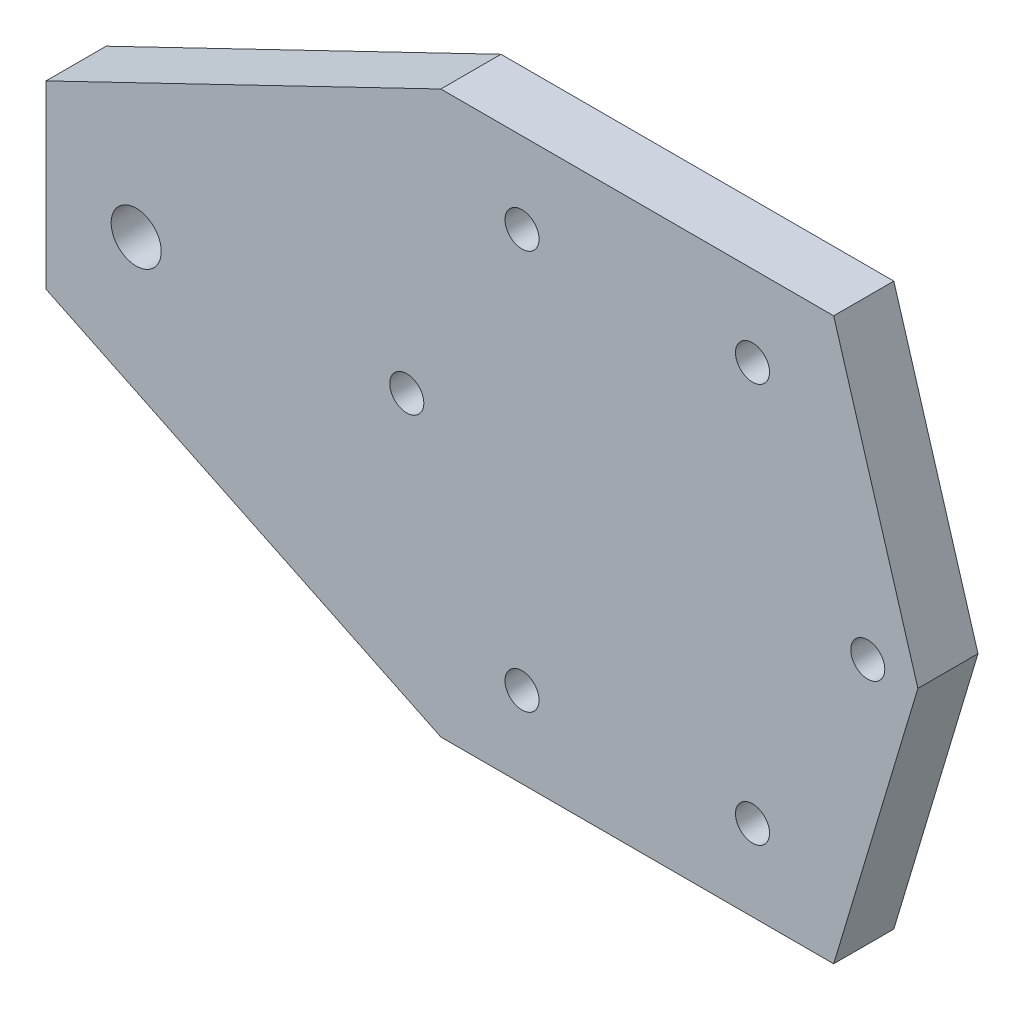
ISO-10303-21;
HEADER;
FILE_DESCRIPTION(('STEP AP214'),'2;1');
FILE_NAME('part.step','',(''),(''),'','','');
FILE_SCHEMA(('AUTOMOTIVE_DESIGN { 1 0 10303 214 1 1 1 1 }'));
ENDSEC;
DATA;
#1=APPLICATION_CONTEXT('core data for automotive mechanical design processes');
#2=APPLICATION_PROTOCOL_DEFINITION('international standard','automotive_design',2000,#1);
#3=PRODUCT_CONTEXT('',#1,'mechanical');
#4=PRODUCT('Part','Part','',(#3));
#5=PRODUCT_RELATED_PRODUCT_CATEGORY('part','',(#4));
#6=PRODUCT_DEFINITION_FORMATION('','',#4);
#7=PRODUCT_DEFINITION_CONTEXT('part definition',#1,'design');
#8=PRODUCT_DEFINITION('design','',#6,#7);
#9=PRODUCT_DEFINITION_SHAPE('','',#8);
#10=(LENGTH_UNIT() NAMED_UNIT(*) SI_UNIT(.MILLI.,.METRE.));
#11=(NAMED_UNIT(*) PLANE_ANGLE_UNIT() SI_UNIT($,.RADIAN.));
#12=(NAMED_UNIT(*) SI_UNIT($,.STERADIAN.) SOLID_ANGLE_UNIT());
#13=UNCERTAINTY_MEASURE_WITH_UNIT(LENGTH_MEASURE(1.E-05),#10,'distance_accuracy_value','');
#14=(GEOMETRIC_REPRESENTATION_CONTEXT(3) GLOBAL_UNCERTAINTY_ASSIGNED_CONTEXT((#13)) GLOBAL_UNIT_ASSIGNED_CONTEXT((#10,
#11,#12)) REPRESENTATION_CONTEXT('',''));
#15=CARTESIAN_POINT('',(0.,0.,0.));
#16=DIRECTION('',(0.,0.,1.));
#17=DIRECTION('',(1.,0.,0.));
#18=AXIS2_PLACEMENT_3D('',#15,#16,#17);
#19=CARTESIAN_POINT('',(0.,0.,6.));
#20=DIRECTION('',(0.,0.,1.));
#21=DIRECTION('',(1.,0.,0.));
#22=AXIS2_PLACEMENT_3D('',#19,#20,#21);
#23=PLANE('',#22);
#24=CARTESIAN_POINT('',(11.5,-19.9185842870421,6.));
#25=DIRECTION('',(0.,0.,1.));
#26=DIRECTION('',(1.,0.,0.));
#27=AXIS2_PLACEMENT_3D('',#24,#25,#26);
#28=CIRCLE('',#27,1.7);
#29=CARTESIAN_POINT('',(13.2,-19.9185842870421,6.));
#30=VERTEX_POINT('',#29);
#31=EDGE_CURVE('E193',#30,#30,#28,.T.);
#32=ORIENTED_EDGE('',*,*,#31,.F.);
#33=EDGE_LOOP('',(#32));
#34=FACE_BOUND('',#33,.T.);
#35=CARTESIAN_POINT('',(-23.,0.,6.));
#36=DIRECTION('',(0.,0.,1.));
#37=DIRECTION('',(1.,0.,0.));
#38=AXIS2_PLACEMENT_3D('',#35,#36,#37);
#39=CIRCLE('',#38,1.7);
#40=CARTESIAN_POINT('',(-21.3,0.,6.));
#41=VERTEX_POINT('',#40);
#42=EDGE_CURVE('E185',#41,#41,#39,.T.);
#43=ORIENTED_EDGE('',*,*,#42,.F.);
#44=EDGE_LOOP('',(#43));
#45=FACE_BOUND('',#44,.T.);
#46=CARTESIAN_POINT('',(11.5,19.9185842870421,6.));
#47=DIRECTION('',(0.,0.,1.));
#48=DIRECTION('',(1.,0.,0.));
#49=AXIS2_PLACEMENT_3D('',#46,#47,#48);
#50=CIRCLE('',#49,1.7);
#51=CARTESIAN_POINT('',(13.2,19.9185842870421,6.));
#52=VERTEX_POINT('',#51);
#53=EDGE_CURVE('E168',#52,#52,#50,.T.);
#54=ORIENTED_EDGE('',*,*,#53,.F.);
#55=EDGE_LOOP('',(#54));
#56=FACE_BOUND('',#55,.T.);
#57=DIRECTION('',(0.,-1.,0.));
#58=VECTOR('',#57,1.);
#59=CARTESIAN_POINT('',(-59.,9.,6.));
#60=LINE('',#59,#58);
#61=CARTESIAN_POINT('',(-59.,9.,6.));
#62=VERTEX_POINT('',#61);
#63=CARTESIAN_POINT('',(-59.,-9.,6.));
#64=VERTEX_POINT('',#63);
#65=EDGE_CURVE('E141',#62,#64,#60,.T.);
#66=ORIENTED_EDGE('',*,*,#65,.T.);
#67=DIRECTION('',(0.900736738123452,-0.43436543208999,0.));
#68=VECTOR('',#67,1.);
#69=CARTESIAN_POINT('',(-59.,-9.,6.));
#70=LINE('',#69,#68);
#71=CARTESIAN_POINT('',(-19.6,-28.,6.));
#72=VERTEX_POINT('',#71);
#73=EDGE_CURVE('E96',#64,#72,#70,.T.);
#74=ORIENTED_EDGE('',*,*,#73,.T.);
#75=DIRECTION('',(1.,0.,0.));
#76=VECTOR('',#75,1.);
#77=CARTESIAN_POINT('',(-19.6,-28.,6.));
#78=LINE('',#77,#76);
#79=CARTESIAN_POINT('',(19.6,-28.,6.));
#80=VERTEX_POINT('',#79);
#81=EDGE_CURVE('E154',#72,#80,#78,.T.);
#82=ORIENTED_EDGE('',*,*,#81,.T.);
#83=DIRECTION('',(0.287347885566345,0.957826285221151,0.));
#84=VECTOR('',#83,1.);
#85=CARTESIAN_POINT('',(19.6,-28.,6.));
#86=LINE('',#85,#84);
#87=CARTESIAN_POINT('',(28.,0.,6.));
#88=VERTEX_POINT('',#87);
#89=EDGE_CURVE('E115',#80,#88,#86,.T.);
#90=ORIENTED_EDGE('',*,*,#89,.T.);
#91=DIRECTION('',(-0.287347885566345,0.957826285221151,0.));
#92=VECTOR('',#91,1.);
#93=CARTESIAN_POINT('',(28.,0.,6.));
#94=LINE('',#93,#92);
#95=CARTESIAN_POINT('',(19.6,28.,6.));
#96=VERTEX_POINT('',#95);
#97=EDGE_CURVE('E106',#88,#96,#94,.T.);
#98=ORIENTED_EDGE('',*,*,#97,.T.);
#99=DIRECTION('',(-1.,0.,0.));
#100=VECTOR('',#99,1.);
#101=CARTESIAN_POINT('',(19.6,28.,6.));
#102=LINE('',#101,#100);
#103=CARTESIAN_POINT('',(-19.6,28.,6.));
#104=VERTEX_POINT('',#103);
#105=EDGE_CURVE('E109',#96,#104,#102,.T.);
#106=ORIENTED_EDGE('',*,*,#105,.T.);
#107=DIRECTION('',(-0.900736738123452,-0.43436543208999,0.));
#108=VECTOR('',#107,1.);
#109=CARTESIAN_POINT('',(-19.6,28.,6.));
#110=LINE('',#109,#108);
#111=EDGE_CURVE('E57',#104,#62,#110,.T.);
#112=ORIENTED_EDGE('',*,*,#111,.T.);
#113=EDGE_LOOP('',(#66,#74,#82,#90,#98,#106,#112));
#114=FACE_BOUND('',#113,.T.);
#115=CARTESIAN_POINT('',(23.,0.,6.));
#116=DIRECTION('',(0.,0.,1.));
#117=DIRECTION('',(1.,0.,0.));
#118=AXIS2_PLACEMENT_3D('',#115,#116,#117);
#119=CIRCLE('',#118,1.7);
#120=CARTESIAN_POINT('',(24.7,0.,6.));
#121=VERTEX_POINT('',#120);
#122=EDGE_CURVE('E131',#121,#121,#119,.T.);
#123=ORIENTED_EDGE('',*,*,#122,.F.);
#124=EDGE_LOOP('',(#123));
#125=FACE_BOUND('',#124,.T.);
#126=CARTESIAN_POINT('',(-11.5,19.9185842870421,6.));
#127=DIRECTION('',(0.,0.,1.));
#128=DIRECTION('',(1.,0.,0.));
#129=AXIS2_PLACEMENT_3D('',#126,#127,#128);
#130=CIRCLE('',#129,1.7);
#131=CARTESIAN_POINT('',(-9.79999999999999,19.9185842870421,6.));
#132=VERTEX_POINT('',#131);
#133=EDGE_CURVE('E176',#132,#132,#130,.T.);
#134=ORIENTED_EDGE('',*,*,#133,.F.);
#135=EDGE_LOOP('',(#134));
#136=FACE_BOUND('',#135,.T.);
#137=CARTESIAN_POINT('',(-11.5,-19.9185842870421,6.));
#138=DIRECTION('',(0.,0.,1.));
#139=DIRECTION('',(1.,0.,0.));
#140=AXIS2_PLACEMENT_3D('',#137,#138,#139);
#141=CIRCLE('',#140,1.7);
#142=CARTESIAN_POINT('',(-9.80000000000001,-19.9185842870421,6.));
#143=VERTEX_POINT('',#142);
#144=EDGE_CURVE('E189',#143,#143,#141,.T.);
#145=ORIENTED_EDGE('',*,*,#144,.F.);
#146=EDGE_LOOP('',(#145));
#147=FACE_BOUND('',#146,.T.);
#148=CARTESIAN_POINT('',(-50.,0.,6.));
#149=DIRECTION('',(0.,0.,1.));
#150=DIRECTION('',(1.,0.,0.));
#151=AXIS2_PLACEMENT_3D('',#148,#149,#150);
#152=CIRCLE('',#151,2.5);
#153=CARTESIAN_POINT('',(-47.5,0.,6.));
#154=VERTEX_POINT('',#153);
#155=EDGE_CURVE('E199',#154,#154,#152,.T.);
#156=ORIENTED_EDGE('',*,*,#155,.F.);
#157=EDGE_LOOP('',(#156));
#158=FACE_BOUND('',#157,.T.);
#159=ADVANCED_FACE('F39',(#34,#45,#56,#114,#125,#136,#147,#158),#23,.T.);
#160=CARTESIAN_POINT('',(0.,0.,0.));
#161=DIRECTION('',(0.,0.,1.));
#162=DIRECTION('',(1.,0.,0.));
#163=AXIS2_PLACEMENT_3D('',#160,#161,#162);
#164=PLANE('',#163);
#165=CARTESIAN_POINT('',(0.,0.,0.));
#166=DIRECTION('',(0.,0.,1.));
#167=DIRECTION('',(1.,0.,0.));
#168=AXIS2_PLACEMENT_3D('',#165,#166,#167);
#169=CIRCLE('',#168,17.15);
#170=CARTESIAN_POINT('',(17.15,0.,0.));
#171=VERTEX_POINT('',#170);
#172=EDGE_CURVE('E207',#171,#171,#169,.T.);
#173=ORIENTED_EDGE('',*,*,#172,.T.);
#174=EDGE_LOOP('',(#173));
#175=FACE_BOUND('',#174,.T.);
#176=DIRECTION('',(0.,-1.,0.));
#177=VECTOR('',#176,1.);
#178=CARTESIAN_POINT('',(-59.,9.,0.));
#179=LINE('',#178,#177);
#180=CARTESIAN_POINT('',(-59.,9.,0.));
#181=VERTEX_POINT('',#180);
#182=CARTESIAN_POINT('',(-59.,-9.,0.));
#183=VERTEX_POINT('',#182);
#184=EDGE_CURVE('E128',#181,#183,#179,.T.);
#185=ORIENTED_EDGE('',*,*,#184,.F.);
#186=DIRECTION('',(-0.900736738123452,-0.43436543208999,0.));
#187=VECTOR('',#186,1.);
#188=CARTESIAN_POINT('',(-19.6,28.,0.));
#189=LINE('',#188,#187);
#190=CARTESIAN_POINT('',(-19.6,28.,0.));
#191=VERTEX_POINT('',#190);
#192=EDGE_CURVE('E86',#191,#181,#189,.T.);
#193=ORIENTED_EDGE('',*,*,#192,.F.);
#194=DIRECTION('',(-1.,0.,0.));
#195=VECTOR('',#194,1.);
#196=CARTESIAN_POINT('',(19.6,28.,0.));
#197=LINE('',#196,#195);
#198=CARTESIAN_POINT('',(19.6,28.,0.));
#199=VERTEX_POINT('',#198);
#200=EDGE_CURVE('E82',#199,#191,#197,.T.);
#201=ORIENTED_EDGE('',*,*,#200,.F.);
#202=DIRECTION('',(-0.287347885566345,0.957826285221151,0.));
#203=VECTOR('',#202,1.);
#204=CARTESIAN_POINT('',(28.,0.,0.));
#205=LINE('',#204,#203);
#206=CARTESIAN_POINT('',(28.,0.,0.));
#207=VERTEX_POINT('',#206);
#208=EDGE_CURVE('E118',#207,#199,#205,.T.);
#209=ORIENTED_EDGE('',*,*,#208,.F.);
#210=DIRECTION('',(0.287347885566345,0.957826285221151,0.));
#211=VECTOR('',#210,1.);
#212=CARTESIAN_POINT('',(19.6,-28.,0.));
#213=LINE('',#212,#211);
#214=CARTESIAN_POINT('',(19.6,-28.,0.));
#215=VERTEX_POINT('',#214);
#216=EDGE_CURVE('E139',#215,#207,#213,.T.);
#217=ORIENTED_EDGE('',*,*,#216,.F.);
#218=DIRECTION('',(1.,0.,0.));
#219=VECTOR('',#218,1.);
#220=CARTESIAN_POINT('',(-19.6,-28.,0.));
#221=LINE('',#220,#219);
#222=CARTESIAN_POINT('',(-19.6,-28.,0.));
#223=VERTEX_POINT('',#222);
#224=EDGE_CURVE('E136',#223,#215,#221,.T.);
#225=ORIENTED_EDGE('',*,*,#224,.F.);
#226=DIRECTION('',(0.900736738123452,-0.43436543208999,0.));
#227=VECTOR('',#226,1.);
#228=CARTESIAN_POINT('',(-59.,-9.,0.));
#229=LINE('',#228,#227);
#230=EDGE_CURVE('E134',#183,#223,#229,.T.);
#231=ORIENTED_EDGE('',*,*,#230,.F.);
#232=EDGE_LOOP('',(#185,#193,#201,#209,#217,#225,#231));
#233=FACE_BOUND('',#232,.T.);
#234=CARTESIAN_POINT('',(23.,0.,0.));
#235=DIRECTION('',(0.,0.,1.));
#236=DIRECTION('',(1.,0.,0.));
#237=AXIS2_PLACEMENT_3D('',#234,#235,#236);
#238=CIRCLE('',#237,1.7);
#239=CARTESIAN_POINT('',(24.7,0.,0.));
#240=VERTEX_POINT('',#239);
#241=EDGE_CURVE('E170',#240,#240,#238,.T.);
#242=ORIENTED_EDGE('',*,*,#241,.T.);
#243=EDGE_LOOP('',(#242));
#244=FACE_BOUND('',#243,.T.);
#245=CARTESIAN_POINT('',(11.5,19.9185842870421,0.));
#246=DIRECTION('',(0.,0.,1.));
#247=DIRECTION('',(1.,0.,0.));
#248=AXIS2_PLACEMENT_3D('',#245,#246,#247);
#249=CIRCLE('',#248,1.7);
#250=CARTESIAN_POINT('',(13.2,19.9185842870421,0.));
#251=VERTEX_POINT('',#250);
#252=EDGE_CURVE('E174',#251,#251,#249,.T.);
#253=ORIENTED_EDGE('',*,*,#252,.T.);
#254=EDGE_LOOP('',(#253));
#255=FACE_BOUND('',#254,.T.);
#256=CARTESIAN_POINT('',(-11.5,19.9185842870421,0.));
#257=DIRECTION('',(0.,0.,1.));
#258=DIRECTION('',(1.,0.,0.));
#259=AXIS2_PLACEMENT_3D('',#256,#257,#258);
#260=CIRCLE('',#259,1.7);
#261=CARTESIAN_POINT('',(-9.79999999999999,19.9185842870421,0.));
#262=VERTEX_POINT('',#261);
#263=EDGE_CURVE('E178',#262,#262,#260,.T.);
#264=ORIENTED_EDGE('',*,*,#263,.T.);
#265=EDGE_LOOP('',(#264));
#266=FACE_BOUND('',#265,.T.);
#267=CARTESIAN_POINT('',(-23.,0.,0.));
#268=DIRECTION('',(0.,0.,1.));
#269=DIRECTION('',(1.,0.,0.));
#270=AXIS2_PLACEMENT_3D('',#267,#268,#269);
#271=CIRCLE('',#270,1.7);
#272=CARTESIAN_POINT('',(-21.3,0.,0.));
#273=VERTEX_POINT('',#272);
#274=EDGE_CURVE('E183',#273,#273,#271,.T.);
#275=ORIENTED_EDGE('',*,*,#274,.T.);
#276=EDGE_LOOP('',(#275));
#277=FACE_BOUND('',#276,.T.);
#278=CARTESIAN_POINT('',(-11.5,-19.9185842870421,0.));
#279=DIRECTION('',(0.,0.,1.));
#280=DIRECTION('',(1.,0.,0.));
#281=AXIS2_PLACEMENT_3D('',#278,#279,#280);
#282=CIRCLE('',#281,1.7);
#283=CARTESIAN_POINT('',(-9.80000000000001,-19.9185842870421,0.));
#284=VERTEX_POINT('',#283);
#285=EDGE_CURVE('E191',#284,#284,#282,.T.);
#286=ORIENTED_EDGE('',*,*,#285,.T.);
#287=EDGE_LOOP('',(#286));
#288=FACE_BOUND('',#287,.T.);
#289=CARTESIAN_POINT('',(11.5,-19.9185842870421,0.));
#290=DIRECTION('',(0.,0.,1.));
#291=DIRECTION('',(1.,0.,0.));
#292=AXIS2_PLACEMENT_3D('',#289,#290,#291);
#293=CIRCLE('',#292,1.7);
#294=CARTESIAN_POINT('',(13.2,-19.9185842870421,0.));
#295=VERTEX_POINT('',#294);
#296=EDGE_CURVE('E197',#295,#295,#293,.T.);
#297=ORIENTED_EDGE('',*,*,#296,.T.);
#298=EDGE_LOOP('',(#297));
#299=FACE_BOUND('',#298,.T.);
#300=CARTESIAN_POINT('',(-50.,0.,0.));
#301=DIRECTION('',(0.,0.,1.));
#302=DIRECTION('',(1.,0.,0.));
#303=AXIS2_PLACEMENT_3D('',#300,#301,#302);
#304=CIRCLE('',#303,2.5);
#305=CARTESIAN_POINT('',(-47.5,0.,0.));
#306=VERTEX_POINT('',#305);
#307=EDGE_CURVE('E201',#306,#306,#304,.T.);
#308=ORIENTED_EDGE('',*,*,#307,.T.);
#309=EDGE_LOOP('',(#308));
#310=FACE_BOUND('',#309,.T.);
#311=ADVANCED_FACE('F157',(#175,#233,#244,#255,#266,#277,#288,#299,#310),#164,.F.);
#312=CARTESIAN_POINT('',(-59.,9.,6.));
#313=DIRECTION('',(1.,0.,0.));
#314=DIRECTION('',(0.,0.,-1.));
#315=AXIS2_PLACEMENT_3D('',#312,#313,#314);
#316=PLANE('',#315);
#317=ORIENTED_EDGE('',*,*,#184,.T.);
#318=DIRECTION('',(0.,0.,-1.));
#319=VECTOR('',#318,1.);
#320=CARTESIAN_POINT('',(-59.,-9.,6.));
#321=LINE('',#320,#319);
#322=EDGE_CURVE('E11',#64,#183,#321,.T.);
#323=ORIENTED_EDGE('',*,*,#322,.F.);
#324=ORIENTED_EDGE('',*,*,#65,.F.);
#325=DIRECTION('',(0.,0.,-1.));
#326=VECTOR('',#325,1.);
#327=CARTESIAN_POINT('',(-59.,9.,6.));
#328=LINE('',#327,#326);
#329=EDGE_CURVE('E127',#62,#181,#328,.T.);
#330=ORIENTED_EDGE('',*,*,#329,.T.);
#331=EDGE_LOOP('',(#317,#323,#324,#330));
#332=FACE_BOUND('',#331,.T.);
#333=ADVANCED_FACE('F41',(#332),#316,.F.);
#334=CARTESIAN_POINT('',(-59.,-9.,6.));
#335=DIRECTION('',(0.43436543208999,0.900736738123452,0.));
#336=DIRECTION('',(-0.900736738123452,0.43436543208999,0.));
#337=AXIS2_PLACEMENT_3D('',#334,#335,#336);
#338=PLANE('',#337);
#339=ORIENTED_EDGE('',*,*,#230,.T.);
#340=DIRECTION('',(0.,0.,-1.));
#341=VECTOR('',#340,1.);
#342=CARTESIAN_POINT('',(-19.6,-28.,6.));
#343=LINE('',#342,#341);
#344=EDGE_CURVE('E48',#72,#223,#343,.T.);
#345=ORIENTED_EDGE('',*,*,#344,.F.);
#346=ORIENTED_EDGE('',*,*,#73,.F.);
#347=ORIENTED_EDGE('',*,*,#322,.T.);
#348=EDGE_LOOP('',(#339,#345,#346,#347));
#349=FACE_BOUND('',#348,.T.);
#350=ADVANCED_FACE('F253',(#349),#338,.F.);
#351=CARTESIAN_POINT('',(-19.6,-28.,6.));
#352=DIRECTION('',(0.,1.,0.));
#353=DIRECTION('',(0.,0.,1.));
#354=AXIS2_PLACEMENT_3D('',#351,#352,#353);
#355=PLANE('',#354);
#356=ORIENTED_EDGE('',*,*,#224,.T.);
#357=DIRECTION('',(0.,0.,-1.));
#358=VECTOR('',#357,1.);
#359=CARTESIAN_POINT('',(19.6,-28.,6.));
#360=LINE('',#359,#358);
#361=EDGE_CURVE('E150',#80,#215,#360,.T.);
#362=ORIENTED_EDGE('',*,*,#361,.F.);
#363=ORIENTED_EDGE('',*,*,#81,.F.);
#364=ORIENTED_EDGE('',*,*,#344,.T.);
#365=EDGE_LOOP('',(#356,#362,#363,#364));
#366=FACE_BOUND('',#365,.T.);
#367=ADVANCED_FACE('F153',(#366),#355,.F.);
#368=CARTESIAN_POINT('',(19.6,-28.,6.));
#369=DIRECTION('',(-0.957826285221151,0.287347885566345,0.));
#370=DIRECTION('',(-0.287347885566345,-0.957826285221152,0.));
#371=AXIS2_PLACEMENT_3D('',#368,#369,#370);
#372=PLANE('',#371);
#373=ORIENTED_EDGE('',*,*,#216,.T.);
#374=DIRECTION('',(0.,0.,-1.));
#375=VECTOR('',#374,1.);
#376=CARTESIAN_POINT('',(28.,0.,6.));
#377=LINE('',#376,#375);
#378=EDGE_CURVE('E121',#88,#207,#377,.T.);
#379=ORIENTED_EDGE('',*,*,#378,.F.);
#380=ORIENTED_EDGE('',*,*,#89,.F.);
#381=ORIENTED_EDGE('',*,*,#361,.T.);
#382=EDGE_LOOP('',(#373,#379,#380,#381));
#383=FACE_BOUND('',#382,.T.);
#384=ADVANCED_FACE('F165',(#383),#372,.F.);
#385=CARTESIAN_POINT('',(28.,0.,6.));
#386=DIRECTION('',(-0.957826285221151,-0.287347885566345,0.));
#387=DIRECTION('',(0.287347885566345,-0.957826285221152,0.));
#388=AXIS2_PLACEMENT_3D('',#385,#386,#387);
#389=PLANE('',#388);
#390=ORIENTED_EDGE('',*,*,#208,.T.);
#391=DIRECTION('',(0.,0.,-1.));
#392=VECTOR('',#391,1.);
#393=CARTESIAN_POINT('',(19.6,28.,6.));
#394=LINE('',#393,#392);
#395=EDGE_CURVE('E120',#96,#199,#394,.T.);
#396=ORIENTED_EDGE('',*,*,#395,.F.);
#397=ORIENTED_EDGE('',*,*,#97,.F.);
#398=ORIENTED_EDGE('',*,*,#378,.T.);
#399=EDGE_LOOP('',(#390,#396,#397,#398));
#400=FACE_BOUND('',#399,.T.);
#401=ADVANCED_FACE('F119',(#400),#389,.F.);
#402=CARTESIAN_POINT('',(19.6,28.,6.));
#403=DIRECTION('',(0.,-1.,0.));
#404=DIRECTION('',(0.,0.,-1.));
#405=AXIS2_PLACEMENT_3D('',#402,#403,#404);
#406=PLANE('',#405);
#407=ORIENTED_EDGE('',*,*,#200,.T.);
#408=DIRECTION('',(0.,0.,-1.));
#409=VECTOR('',#408,1.);
#410=CARTESIAN_POINT('',(-19.6,28.,6.));
#411=LINE('',#410,#409);
#412=EDGE_CURVE('E122',#104,#191,#411,.T.);
#413=ORIENTED_EDGE('',*,*,#412,.F.);
#414=ORIENTED_EDGE('',*,*,#105,.F.);
#415=ORIENTED_EDGE('',*,*,#395,.T.);
#416=EDGE_LOOP('',(#407,#413,#414,#415));
#417=FACE_BOUND('',#416,.T.);
#418=ADVANCED_FACE('F123',(#417),#406,.F.);
#419=CARTESIAN_POINT('',(-19.6,28.,6.));
#420=DIRECTION('',(0.43436543208999,-0.900736738123452,0.));
#421=DIRECTION('',(0.900736738123452,0.43436543208999,0.));
#422=AXIS2_PLACEMENT_3D('',#419,#420,#421);
#423=PLANE('',#422);
#424=ORIENTED_EDGE('',*,*,#192,.T.);
#425=ORIENTED_EDGE('',*,*,#329,.F.);
#426=ORIENTED_EDGE('',*,*,#111,.F.);
#427=ORIENTED_EDGE('',*,*,#412,.T.);
#428=EDGE_LOOP('',(#424,#425,#426,#427));
#429=FACE_BOUND('',#428,.T.);
#430=ADVANCED_FACE('F242',(#429),#423,.F.);
#431=CARTESIAN_POINT('',(23.,0.,6.));
#432=DIRECTION('',(0.,0.,-1.));
#433=DIRECTION('',(-1.,0.,0.));
#434=AXIS2_PLACEMENT_3D('',#431,#432,#433);
#435=CYLINDRICAL_SURFACE('',#434,1.7);
#436=ORIENTED_EDGE('',*,*,#122,.T.);
#437=EDGE_LOOP('',(#436));
#438=FACE_BOUND('',#437,.T.);
#439=ORIENTED_EDGE('',*,*,#241,.F.);
#440=EDGE_LOOP('',(#439));
#441=FACE_BOUND('',#440,.T.);
#442=ADVANCED_FACE('F236',(#438,#441),#435,.F.);
#443=CARTESIAN_POINT('',(11.5,19.9185842870421,6.));
#444=DIRECTION('',(0.,0.,-1.));
#445=DIRECTION('',(-1.,0.,0.));
#446=AXIS2_PLACEMENT_3D('',#443,#444,#445);
#447=CYLINDRICAL_SURFACE('',#446,1.7);
#448=ORIENTED_EDGE('',*,*,#53,.T.);
#449=EDGE_LOOP('',(#448));
#450=FACE_BOUND('',#449,.T.);
#451=ORIENTED_EDGE('',*,*,#252,.F.);
#452=EDGE_LOOP('',(#451));
#453=FACE_BOUND('',#452,.T.);
#454=ADVANCED_FACE('F306',(#450,#453),#447,.F.);
#455=CARTESIAN_POINT('',(-11.5,19.9185842870421,6.));
#456=DIRECTION('',(0.,0.,-1.));
#457=DIRECTION('',(-1.,0.,0.));
#458=AXIS2_PLACEMENT_3D('',#455,#456,#457);
#459=CYLINDRICAL_SURFACE('',#458,1.7);
#460=ORIENTED_EDGE('',*,*,#133,.T.);
#461=EDGE_LOOP('',(#460));
#462=FACE_BOUND('',#461,.T.);
#463=ORIENTED_EDGE('',*,*,#263,.F.);
#464=EDGE_LOOP('',(#463));
#465=FACE_BOUND('',#464,.T.);
#466=ADVANCED_FACE('F320',(#462,#465),#459,.F.);
#467=CARTESIAN_POINT('',(-23.,0.,6.));
#468=DIRECTION('',(0.,0.,-1.));
#469=DIRECTION('',(-1.,0.,0.));
#470=AXIS2_PLACEMENT_3D('',#467,#468,#469);
#471=CYLINDRICAL_SURFACE('',#470,1.7);
#472=ORIENTED_EDGE('',*,*,#42,.T.);
#473=EDGE_LOOP('',(#472));
#474=FACE_BOUND('',#473,.T.);
#475=ORIENTED_EDGE('',*,*,#274,.F.);
#476=EDGE_LOOP('',(#475));
#477=FACE_BOUND('',#476,.T.);
#478=ADVANCED_FACE('F326',(#474,#477),#471,.F.);
#479=CARTESIAN_POINT('',(-11.5,-19.9185842870421,6.));
#480=DIRECTION('',(0.,0.,-1.));
#481=DIRECTION('',(-1.,0.,0.));
#482=AXIS2_PLACEMENT_3D('',#479,#480,#481);
#483=CYLINDRICAL_SURFACE('',#482,1.7);
#484=ORIENTED_EDGE('',*,*,#144,.T.);
#485=EDGE_LOOP('',(#484));
#486=FACE_BOUND('',#485,.T.);
#487=ORIENTED_EDGE('',*,*,#285,.F.);
#488=EDGE_LOOP('',(#487));
#489=FACE_BOUND('',#488,.T.);
#490=ADVANCED_FACE('F337',(#486,#489),#483,.F.);
#491=CARTESIAN_POINT('',(11.5,-19.9185842870421,6.));
#492=DIRECTION('',(0.,0.,-1.));
#493=DIRECTION('',(-1.,0.,0.));
#494=AXIS2_PLACEMENT_3D('',#491,#492,#493);
#495=CYLINDRICAL_SURFACE('',#494,1.7);
#496=ORIENTED_EDGE('',*,*,#31,.T.);
#497=EDGE_LOOP('',(#496));
#498=FACE_BOUND('',#497,.T.);
#499=ORIENTED_EDGE('',*,*,#296,.F.);
#500=EDGE_LOOP('',(#499));
#501=FACE_BOUND('',#500,.T.);
#502=ADVANCED_FACE('F347',(#498,#501),#495,.F.);
#503=CARTESIAN_POINT('',(-50.,0.,6.));
#504=DIRECTION('',(0.,0.,-1.));
#505=DIRECTION('',(-1.,0.,0.));
#506=AXIS2_PLACEMENT_3D('',#503,#504,#505);
#507=CYLINDRICAL_SURFACE('',#506,2.5);
#508=ORIENTED_EDGE('',*,*,#155,.T.);
#509=EDGE_LOOP('',(#508));
#510=FACE_BOUND('',#509,.T.);
#511=ORIENTED_EDGE('',*,*,#307,.F.);
#512=EDGE_LOOP('',(#511));
#513=FACE_BOUND('',#512,.T.);
#514=ADVANCED_FACE('F221',(#510,#513),#507,.F.);
#515=CARTESIAN_POINT('',(0.,0.,2.2));
#516=DIRECTION('',(0.,0.,-1.));
#517=DIRECTION('',(-1.,0.,0.));
#518=AXIS2_PLACEMENT_3D('',#515,#516,#517);
#519=CYLINDRICAL_SURFACE('',#518,17.15);
#520=CARTESIAN_POINT('',(0.,0.,2.2));
#521=DIRECTION('',(0.,0.,1.));
#522=DIRECTION('',(1.,0.,0.));
#523=AXIS2_PLACEMENT_3D('',#520,#521,#522);
#524=CIRCLE('',#523,17.15);
#525=CARTESIAN_POINT('',(17.15,0.,2.2));
#526=VERTEX_POINT('',#525);
#527=EDGE_CURVE('E206',#526,#526,#524,.T.);
#528=ORIENTED_EDGE('',*,*,#527,.T.);
#529=EDGE_LOOP('',(#528));
#530=FACE_BOUND('',#529,.T.);
#531=ORIENTED_EDGE('',*,*,#172,.F.);
#532=EDGE_LOOP('',(#531));
#533=FACE_BOUND('',#532,.T.);
#534=ADVANCED_FACE('F214',(#530,#533),#519,.F.);
#535=CARTESIAN_POINT('',(0.,0.,2.2));
#536=DIRECTION('',(0.,0.,1.));
#537=DIRECTION('',(1.,0.,0.));
#538=AXIS2_PLACEMENT_3D('',#535,#536,#537);
#539=PLANE('',#538);
#540=ORIENTED_EDGE('',*,*,#527,.F.);
#541=EDGE_LOOP('',(#540));
#542=FACE_BOUND('',#541,.T.);
#543=ADVANCED_FACE('F217',(#542),#539,.F.);
#544=CLOSED_SHELL('',(#159,#311,#333,#350,#367,#384,#401,#418,#430,#442,#454,#466,#478,#490,
#502,#514,#534,#543));
#545=MANIFOLD_SOLID_BREP('B2',#544);
#546=ADVANCED_BREP_SHAPE_REPRESENTATION('',(#18,#545),#14);
#547=SHAPE_DEFINITION_REPRESENTATION(#9,#546);
ENDSEC;
END-ISO-10303-21;
